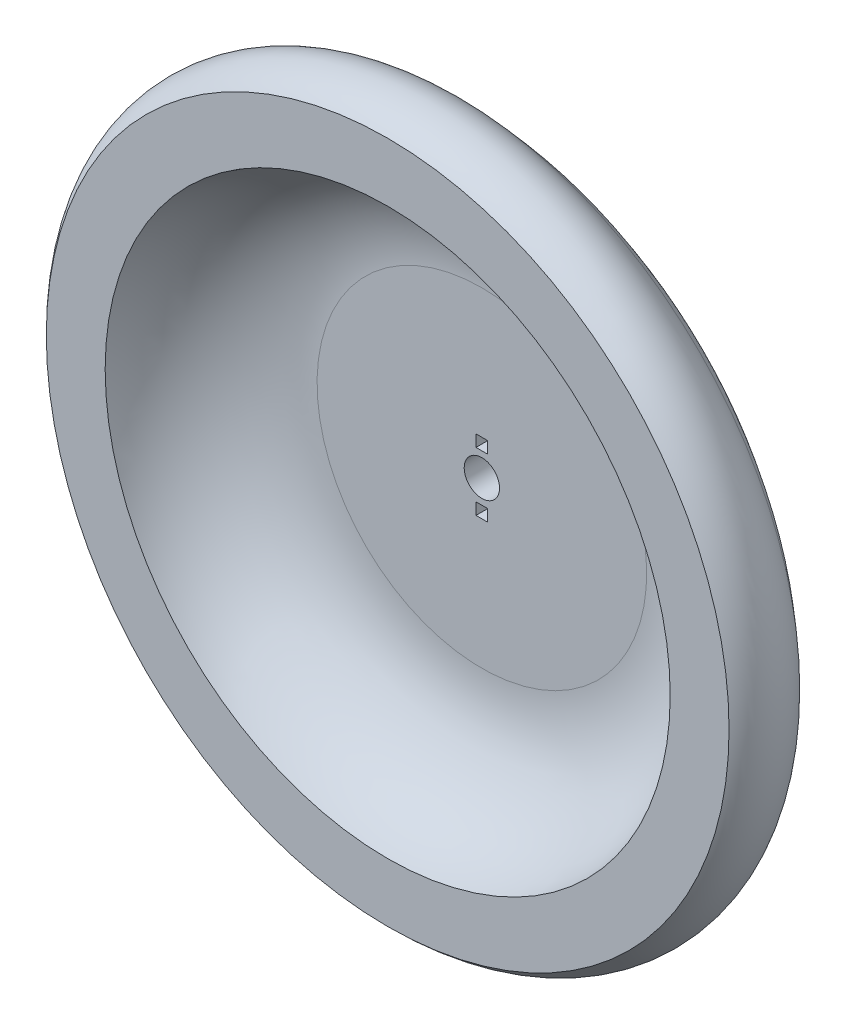
ISO-10303-21;
HEADER;
FILE_DESCRIPTION(('STEP AP214'),'2;1');
FILE_NAME('part.step','',(''),(''),'','','');
FILE_SCHEMA(('AUTOMOTIVE_DESIGN { 1 0 10303 214 1 1 1 1 }'));
ENDSEC;
DATA;
#1=APPLICATION_CONTEXT('core data for automotive mechanical design processes');
#2=APPLICATION_PROTOCOL_DEFINITION('international standard','automotive_design',2000,#1);
#3=PRODUCT_CONTEXT('',#1,'mechanical');
#4=PRODUCT('Part','Part','',(#3));
#5=PRODUCT_RELATED_PRODUCT_CATEGORY('part','',(#4));
#6=PRODUCT_DEFINITION_FORMATION('','',#4);
#7=PRODUCT_DEFINITION_CONTEXT('part definition',#1,'design');
#8=PRODUCT_DEFINITION('design','',#6,#7);
#9=PRODUCT_DEFINITION_SHAPE('','',#8);
#10=(LENGTH_UNIT() NAMED_UNIT(*) SI_UNIT(.MILLI.,.METRE.));
#11=(NAMED_UNIT(*) PLANE_ANGLE_UNIT() SI_UNIT($,.RADIAN.));
#12=(NAMED_UNIT(*) SI_UNIT($,.STERADIAN.) SOLID_ANGLE_UNIT());
#13=UNCERTAINTY_MEASURE_WITH_UNIT(LENGTH_MEASURE(1.E-05),#10,'distance_accuracy_value','');
#14=(GEOMETRIC_REPRESENTATION_CONTEXT(3) GLOBAL_UNCERTAINTY_ASSIGNED_CONTEXT((#13)) GLOBAL_UNIT_ASSIGNED_CONTEXT((#10,
#11,#12)) REPRESENTATION_CONTEXT('',''));
#15=CARTESIAN_POINT('',(0.,0.,0.));
#16=DIRECTION('',(0.,0.,1.));
#17=DIRECTION('',(1.,0.,0.));
#18=AXIS2_PLACEMENT_3D('',#15,#16,#17);
#19=CARTESIAN_POINT('',(0.,0.,-6.));
#20=DIRECTION('',(0.,0.,-1.));
#21=DIRECTION('',(0.,1.,0.));
#22=AXIS2_PLACEMENT_3D('',#19,#20,#21);
#23=TOROIDAL_SURFACE('',#22,26.1428571428571,4.14285714285714);
#24=CARTESIAN_POINT('',(0.,0.,-3.));
#25=DIRECTION('',(0.,0.,-1.));
#26=DIRECTION('',(0.,1.,0.));
#27=AXIS2_PLACEMENT_3D('',#24,#25,#26);
#28=CIRCLE('',#27,29.);
#29=CARTESIAN_POINT('',(0.,29.,-3.));
#30=VERTEX_POINT('',#29);
#31=EDGE_CURVE('E11',#30,#30,#28,.T.);
#32=ORIENTED_EDGE('',*,*,#31,.T.);
#33=EDGE_LOOP('',(#32));
#34=FACE_BOUND('',#33,.T.);
#35=CARTESIAN_POINT('',(0.,0.,-9.));
#36=DIRECTION('',(0.,0.,-1.));
#37=DIRECTION('',(0.,1.,0.));
#38=AXIS2_PLACEMENT_3D('',#35,#36,#37);
#39=CIRCLE('',#38,29.);
#40=CARTESIAN_POINT('',(0.,29.,-9.));
#41=VERTEX_POINT('',#40);
#42=EDGE_CURVE('E204',#41,#41,#39,.T.);
#43=ORIENTED_EDGE('',*,*,#42,.F.);
#44=EDGE_LOOP('',(#43));
#45=FACE_BOUND('',#44,.T.);
#46=ADVANCED_FACE('F39',(#34,#45),#23,.T.);
#47=CARTESIAN_POINT('',(0.,24.,-3.));
#48=DIRECTION('',(0.,0.,1.));
#49=DIRECTION('',(0.,-1.,0.));
#50=AXIS2_PLACEMENT_3D('',#47,#48,#49);
#51=PLANE('',#50);
#52=CARTESIAN_POINT('',(0.,0.,-3.));
#53=DIRECTION('',(0.,0.,-1.));
#54=DIRECTION('',(0.,1.,0.));
#55=AXIS2_PLACEMENT_3D('',#52,#53,#54);
#56=CIRCLE('',#55,24.);
#57=CARTESIAN_POINT('',(0.,24.,-3.));
#58=VERTEX_POINT('',#57);
#59=EDGE_CURVE('E47',#58,#58,#56,.T.);
#60=ORIENTED_EDGE('',*,*,#59,.T.);
#61=EDGE_LOOP('',(#60));
#62=FACE_BOUND('',#61,.T.);
#63=ORIENTED_EDGE('',*,*,#31,.F.);
#64=EDGE_LOOP('',(#63));
#65=FACE_BOUND('',#64,.T.);
#66=ADVANCED_FACE('F219',(#62,#65),#51,.T.);
#67=CARTESIAN_POINT('',(0.,0.,-0.750000000000003));
#68=DIRECTION('',(0.,0.,-1.));
#69=DIRECTION('',(0.,1.,0.));
#70=AXIS2_PLACEMENT_3D('',#67,#68,#69);
#71=TOROIDAL_SURFACE('',#70,14.,10.25);
#72=CARTESIAN_POINT('',(0.,0.,-11.));
#73=DIRECTION('',(0.,0.,-1.));
#74=DIRECTION('',(0.,1.,0.));
#75=AXIS2_PLACEMENT_3D('',#72,#73,#74);
#76=CIRCLE('',#75,14.);
#77=CARTESIAN_POINT('',(0.,14.,-11.));
#78=VERTEX_POINT('',#77);
#79=EDGE_CURVE('E212',#78,#78,#76,.T.);
#80=ORIENTED_EDGE('',*,*,#79,.T.);
#81=EDGE_LOOP('',(#80));
#82=FACE_BOUND('',#81,.T.);
#83=ORIENTED_EDGE('',*,*,#59,.F.);
#84=EDGE_LOOP('',(#83));
#85=FACE_BOUND('',#84,.T.);
#86=ADVANCED_FACE('F222',(#82,#85),#71,.F.);
#87=CARTESIAN_POINT('',(0.,14.,-11.));
#88=DIRECTION('',(0.,0.,1.));
#89=DIRECTION('',(0.,-1.,0.));
#90=AXIS2_PLACEMENT_3D('',#87,#88,#89);
#91=PLANE('',#90);
#92=DIRECTION('',(0.,-1.,0.));
#93=VECTOR('',#92,1.);
#94=CARTESIAN_POINT('',(-0.5,3.00000000000001,-11.));
#95=LINE('',#94,#93);
#96=CARTESIAN_POINT('',(-0.5,3.00000000000001,-11.));
#97=VERTEX_POINT('',#96);
#98=CARTESIAN_POINT('',(-0.5,2.00000000000001,-11.));
#99=VERTEX_POINT('',#98);
#100=EDGE_CURVE('E54',#97,#99,#95,.T.);
#101=ORIENTED_EDGE('',*,*,#100,.F.);
#102=DIRECTION('',(-1.,0.,0.));
#103=VECTOR('',#102,1.);
#104=CARTESIAN_POINT('',(-0.5,3.00000000000001,-11.));
#105=LINE('',#104,#103);
#106=CARTESIAN_POINT('',(0.5,3.00000000000001,-11.));
#107=VERTEX_POINT('',#106);
#108=EDGE_CURVE('E127',#107,#97,#105,.T.);
#109=ORIENTED_EDGE('',*,*,#108,.F.);
#110=DIRECTION('',(0.,1.,0.));
#111=VECTOR('',#110,1.);
#112=CARTESIAN_POINT('',(0.5,3.00000000000001,-11.));
#113=LINE('',#112,#111);
#114=CARTESIAN_POINT('',(0.5,2.00000000000001,-11.));
#115=VERTEX_POINT('',#114);
#116=EDGE_CURVE('E131',#115,#107,#113,.T.);
#117=ORIENTED_EDGE('',*,*,#116,.F.);
#118=DIRECTION('',(1.,0.,0.));
#119=VECTOR('',#118,1.);
#120=CARTESIAN_POINT('',(-0.5,2.00000000000001,-11.));
#121=LINE('',#120,#119);
#122=EDGE_CURVE('E140',#99,#115,#121,.T.);
#123=ORIENTED_EDGE('',*,*,#122,.F.);
#124=EDGE_LOOP('',(#101,#109,#117,#123));
#125=FACE_BOUND('',#124,.T.);
#126=DIRECTION('',(0.,-1.,0.));
#127=VECTOR('',#126,1.);
#128=CARTESIAN_POINT('',(-0.5,-2.,-11.));
#129=LINE('',#128,#127);
#130=CARTESIAN_POINT('',(-0.5,-2.,-11.));
#131=VERTEX_POINT('',#130);
#132=CARTESIAN_POINT('',(-0.5,-3.,-11.));
#133=VERTEX_POINT('',#132);
#134=EDGE_CURVE('E62',#131,#133,#129,.T.);
#135=ORIENTED_EDGE('',*,*,#134,.F.);
#136=DIRECTION('',(-1.,0.,0.));
#137=VECTOR('',#136,1.);
#138=CARTESIAN_POINT('',(-0.5,-2.,-11.));
#139=LINE('',#138,#137);
#140=CARTESIAN_POINT('',(0.5,-2.,-11.));
#141=VERTEX_POINT('',#140);
#142=EDGE_CURVE('E161',#141,#131,#139,.T.);
#143=ORIENTED_EDGE('',*,*,#142,.F.);
#144=DIRECTION('',(0.,1.,0.));
#145=VECTOR('',#144,1.);
#146=CARTESIAN_POINT('',(0.5,-2.,-11.));
#147=LINE('',#146,#145);
#148=CARTESIAN_POINT('',(0.5,-3.,-11.));
#149=VERTEX_POINT('',#148);
#150=EDGE_CURVE('E180',#149,#141,#147,.T.);
#151=ORIENTED_EDGE('',*,*,#150,.F.);
#152=DIRECTION('',(1.,0.,0.));
#153=VECTOR('',#152,1.);
#154=CARTESIAN_POINT('',(-0.5,-3.,-11.));
#155=LINE('',#154,#153);
#156=EDGE_CURVE('E176',#133,#149,#155,.T.);
#157=ORIENTED_EDGE('',*,*,#156,.F.);
#158=EDGE_LOOP('',(#135,#143,#151,#157));
#159=FACE_BOUND('',#158,.T.);
#160=CARTESIAN_POINT('',(0.,0.,-11.));
#161=DIRECTION('',(0.,0.,1.));
#162=DIRECTION('',(0.,-1.,0.));
#163=AXIS2_PLACEMENT_3D('',#160,#161,#162);
#164=CIRCLE('',#163,1.5);
#165=CARTESIAN_POINT('',(0.,-1.5,-11.));
#166=VERTEX_POINT('',#165);
#167=EDGE_CURVE('E200',#166,#166,#164,.T.);
#168=ORIENTED_EDGE('',*,*,#167,.F.);
#169=EDGE_LOOP('',(#168));
#170=FACE_BOUND('',#169,.T.);
#171=ORIENTED_EDGE('',*,*,#79,.F.);
#172=EDGE_LOOP('',(#171));
#173=FACE_BOUND('',#172,.T.);
#174=ADVANCED_FACE('F224',(#125,#159,#170,#173),#91,.T.);
#175=CARTESIAN_POINT('',(0.,0.,-15.));
#176=DIRECTION('',(0.,0.,-1.));
#177=DIRECTION('',(0.,1.,0.));
#178=AXIS2_PLACEMENT_3D('',#175,#176,#177);
#179=PLANE('',#178);
#180=CARTESIAN_POINT('',(0.,0.,-15.));
#181=DIRECTION('',(0.,0.,-1.));
#182=DIRECTION('',(0.,1.,0.));
#183=AXIS2_PLACEMENT_3D('',#180,#181,#182);
#184=CIRCLE('',#183,1.5);
#185=CARTESIAN_POINT('',(0.,1.5,-15.));
#186=VERTEX_POINT('',#185);
#187=EDGE_CURVE('E150',#186,#186,#184,.T.);
#188=ORIENTED_EDGE('',*,*,#187,.F.);
#189=EDGE_LOOP('',(#188));
#190=FACE_BOUND('',#189,.T.);
#191=CARTESIAN_POINT('',(0.,0.,-15.));
#192=DIRECTION('',(0.,0.,-1.));
#193=DIRECTION('',(0.,1.,0.));
#194=AXIS2_PLACEMENT_3D('',#191,#192,#193);
#195=CIRCLE('',#194,14.);
#196=CARTESIAN_POINT('',(0.,14.,-15.));
#197=VERTEX_POINT('',#196);
#198=EDGE_CURVE('E208',#197,#197,#195,.T.);
#199=ORIENTED_EDGE('',*,*,#198,.T.);
#200=EDGE_LOOP('',(#199));
#201=FACE_BOUND('',#200,.T.);
#202=ADVANCED_FACE('F231',(#190,#201),#179,.T.);
#203=CARTESIAN_POINT('',(0.,0.,6.75));
#204=DIRECTION('',(0.,0.,-1.));
#205=DIRECTION('',(0.,1.,0.));
#206=AXIS2_PLACEMENT_3D('',#203,#204,#205);
#207=DEGENERATE_TOROIDAL_SURFACE('',#206,14.,21.75,.T.);
#208=ORIENTED_EDGE('',*,*,#42,.T.);
#209=EDGE_LOOP('',(#208));
#210=FACE_BOUND('',#209,.T.);
#211=ORIENTED_EDGE('',*,*,#198,.F.);
#212=EDGE_LOOP('',(#211));
#213=FACE_BOUND('',#212,.T.);
#214=ADVANCED_FACE('F242',(#210,#213),#207,.T.);
#215=CARTESIAN_POINT('',(0.,0.,-15.));
#216=DIRECTION('',(0.,0.,-1.));
#217=DIRECTION('',(0.,1.,0.));
#218=AXIS2_PLACEMENT_3D('',#215,#216,#217);
#219=CYLINDRICAL_SURFACE('',#218,1.5);
#220=ORIENTED_EDGE('',*,*,#167,.T.);
#221=EDGE_LOOP('',(#220));
#222=FACE_BOUND('',#221,.T.);
#223=ORIENTED_EDGE('',*,*,#187,.T.);
#224=EDGE_LOOP('',(#223));
#225=FACE_BOUND('',#224,.T.);
#226=ADVANCED_FACE('F245',(#222,#225),#219,.F.);
#227=CARTESIAN_POINT('',(-0.5,-2.,-13.));
#228=DIRECTION('',(-1.,0.,0.));
#229=DIRECTION('',(0.,0.,1.));
#230=AXIS2_PLACEMENT_3D('',#227,#228,#229);
#231=PLANE('',#230);
#232=ORIENTED_EDGE('',*,*,#134,.T.);
#233=DIRECTION('',(0.,0.,1.));
#234=VECTOR('',#233,1.);
#235=CARTESIAN_POINT('',(-0.5,-3.,-13.));
#236=LINE('',#235,#234);
#237=CARTESIAN_POINT('',(-0.5,-3.,-13.));
#238=VERTEX_POINT('',#237);
#239=EDGE_CURVE('E173',#238,#133,#236,.T.);
#240=ORIENTED_EDGE('',*,*,#239,.F.);
#241=DIRECTION('',(0.,-1.,0.));
#242=VECTOR('',#241,1.);
#243=CARTESIAN_POINT('',(-0.5,-2.,-13.));
#244=LINE('',#243,#242);
#245=CARTESIAN_POINT('',(-0.5,-2.,-13.));
#246=VERTEX_POINT('',#245);
#247=EDGE_CURVE('E156',#246,#238,#244,.T.);
#248=ORIENTED_EDGE('',*,*,#247,.F.);
#249=DIRECTION('',(0.,0.,1.));
#250=VECTOR('',#249,1.);
#251=CARTESIAN_POINT('',(-0.5,-2.,-13.));
#252=LINE('',#251,#250);
#253=EDGE_CURVE('E141',#246,#131,#252,.T.);
#254=ORIENTED_EDGE('',*,*,#253,.T.);
#255=EDGE_LOOP('',(#232,#240,#248,#254));
#256=FACE_BOUND('',#255,.T.);
#257=ADVANCED_FACE('F258',(#256),#231,.F.);
#258=CARTESIAN_POINT('',(-0.5,-2.,-13.));
#259=DIRECTION('',(0.,1.,0.));
#260=DIRECTION('',(0.,0.,1.));
#261=AXIS2_PLACEMENT_3D('',#258,#259,#260);
#262=PLANE('',#261);
#263=ORIENTED_EDGE('',*,*,#142,.T.);
#264=ORIENTED_EDGE('',*,*,#253,.F.);
#265=DIRECTION('',(-1.,0.,0.));
#266=VECTOR('',#265,1.);
#267=CARTESIAN_POINT('',(-0.5,-2.,-13.));
#268=LINE('',#267,#266);
#269=CARTESIAN_POINT('',(0.5,-2.,-13.));
#270=VERTEX_POINT('',#269);
#271=EDGE_CURVE('E169',#270,#246,#268,.T.);
#272=ORIENTED_EDGE('',*,*,#271,.F.);
#273=DIRECTION('',(0.,0.,1.));
#274=VECTOR('',#273,1.);
#275=CARTESIAN_POINT('',(0.5,-2.,-13.));
#276=LINE('',#275,#274);
#277=EDGE_CURVE('E189',#270,#141,#276,.T.);
#278=ORIENTED_EDGE('',*,*,#277,.T.);
#279=EDGE_LOOP('',(#263,#264,#272,#278));
#280=FACE_BOUND('',#279,.T.);
#281=ADVANCED_FACE('F262',(#280),#262,.F.);
#282=CARTESIAN_POINT('',(0.5,-2.,-13.));
#283=DIRECTION('',(1.,0.,0.));
#284=DIRECTION('',(0.,0.,-1.));
#285=AXIS2_PLACEMENT_3D('',#282,#283,#284);
#286=PLANE('',#285);
#287=ORIENTED_EDGE('',*,*,#150,.T.);
#288=ORIENTED_EDGE('',*,*,#277,.F.);
#289=DIRECTION('',(0.,1.,0.));
#290=VECTOR('',#289,1.);
#291=CARTESIAN_POINT('',(0.5,-2.,-13.));
#292=LINE('',#291,#290);
#293=CARTESIAN_POINT('',(0.5,-3.,-13.));
#294=VERTEX_POINT('',#293);
#295=EDGE_CURVE('E165',#294,#270,#292,.T.);
#296=ORIENTED_EDGE('',*,*,#295,.F.);
#297=DIRECTION('',(0.,0.,1.));
#298=VECTOR('',#297,1.);
#299=CARTESIAN_POINT('',(0.5,-3.,-13.));
#300=LINE('',#299,#298);
#301=EDGE_CURVE('E192',#294,#149,#300,.T.);
#302=ORIENTED_EDGE('',*,*,#301,.T.);
#303=EDGE_LOOP('',(#287,#288,#296,#302));
#304=FACE_BOUND('',#303,.T.);
#305=ADVANCED_FACE('F267',(#304),#286,.F.);
#306=CARTESIAN_POINT('',(-0.5,-3.,-13.));
#307=DIRECTION('',(0.,-1.,0.));
#308=DIRECTION('',(0.,0.,-1.));
#309=AXIS2_PLACEMENT_3D('',#306,#307,#308);
#310=PLANE('',#309);
#311=ORIENTED_EDGE('',*,*,#156,.T.);
#312=ORIENTED_EDGE('',*,*,#301,.F.);
#313=DIRECTION('',(1.,0.,0.));
#314=VECTOR('',#313,1.);
#315=CARTESIAN_POINT('',(-0.5,-3.,-13.));
#316=LINE('',#315,#314);
#317=EDGE_CURVE('E160',#238,#294,#316,.T.);
#318=ORIENTED_EDGE('',*,*,#317,.F.);
#319=ORIENTED_EDGE('',*,*,#239,.T.);
#320=EDGE_LOOP('',(#311,#312,#318,#319));
#321=FACE_BOUND('',#320,.T.);
#322=ADVANCED_FACE('F263',(#321),#310,.F.);
#323=CARTESIAN_POINT('',(0.,0.,-13.));
#324=DIRECTION('',(0.,0.,1.));
#325=DIRECTION('',(1.,0.,0.));
#326=AXIS2_PLACEMENT_3D('',#323,#324,#325);
#327=PLANE('',#326);
#328=ORIENTED_EDGE('',*,*,#247,.T.);
#329=ORIENTED_EDGE('',*,*,#317,.T.);
#330=ORIENTED_EDGE('',*,*,#295,.T.);
#331=ORIENTED_EDGE('',*,*,#271,.T.);
#332=EDGE_LOOP('',(#328,#329,#330,#331));
#333=FACE_BOUND('',#332,.T.);
#334=ADVANCED_FACE('F266',(#333),#327,.T.);
#335=CARTESIAN_POINT('',(-0.5,3.00000000000001,-13.));
#336=DIRECTION('',(-1.,0.,0.));
#337=DIRECTION('',(0.,0.,1.));
#338=AXIS2_PLACEMENT_3D('',#335,#336,#337);
#339=PLANE('',#338);
#340=ORIENTED_EDGE('',*,*,#100,.T.);
#341=DIRECTION('',(0.,0.,1.));
#342=VECTOR('',#341,1.);
#343=CARTESIAN_POINT('',(-0.5,2.00000000000001,-13.));
#344=LINE('',#343,#342);
#345=CARTESIAN_POINT('',(-0.5,2.00000000000001,-13.));
#346=VERTEX_POINT('',#345);
#347=EDGE_CURVE('E102',#346,#99,#344,.T.);
#348=ORIENTED_EDGE('',*,*,#347,.F.);
#349=DIRECTION('',(0.,-1.,0.));
#350=VECTOR('',#349,1.);
#351=CARTESIAN_POINT('',(-0.5,3.00000000000001,-13.));
#352=LINE('',#351,#350);
#353=CARTESIAN_POINT('',(-0.5,3.00000000000001,-13.));
#354=VERTEX_POINT('',#353);
#355=EDGE_CURVE('E106',#354,#346,#352,.T.);
#356=ORIENTED_EDGE('',*,*,#355,.F.);
#357=DIRECTION('',(0.,0.,1.));
#358=VECTOR('',#357,1.);
#359=CARTESIAN_POINT('',(-0.5,3.00000000000001,-13.));
#360=LINE('',#359,#358);
#361=EDGE_CURVE('E147',#354,#97,#360,.T.);
#362=ORIENTED_EDGE('',*,*,#361,.T.);
#363=EDGE_LOOP('',(#340,#348,#356,#362));
#364=FACE_BOUND('',#363,.T.);
#365=ADVANCED_FACE('F104',(#364),#339,.F.);
#366=CARTESIAN_POINT('',(-0.5,3.00000000000001,-13.));
#367=DIRECTION('',(0.,1.,0.));
#368=DIRECTION('',(0.,0.,1.));
#369=AXIS2_PLACEMENT_3D('',#366,#367,#368);
#370=PLANE('',#369);
#371=ORIENTED_EDGE('',*,*,#108,.T.);
#372=ORIENTED_EDGE('',*,*,#361,.F.);
#373=DIRECTION('',(-1.,0.,0.));
#374=VECTOR('',#373,1.);
#375=CARTESIAN_POINT('',(-0.5,3.00000000000001,-13.));
#376=LINE('',#375,#374);
#377=CARTESIAN_POINT('',(0.5,3.00000000000001,-13.));
#378=VERTEX_POINT('',#377);
#379=EDGE_CURVE('E113',#378,#354,#376,.T.);
#380=ORIENTED_EDGE('',*,*,#379,.F.);
#381=DIRECTION('',(0.,0.,1.));
#382=VECTOR('',#381,1.);
#383=CARTESIAN_POINT('',(0.5,3.00000000000001,-13.));
#384=LINE('',#383,#382);
#385=EDGE_CURVE('E151',#378,#107,#384,.T.);
#386=ORIENTED_EDGE('',*,*,#385,.T.);
#387=EDGE_LOOP('',(#371,#372,#380,#386));
#388=FACE_BOUND('',#387,.T.);
#389=ADVANCED_FACE('F280',(#388),#370,.F.);
#390=CARTESIAN_POINT('',(0.5,3.00000000000001,-13.));
#391=DIRECTION('',(1.,0.,0.));
#392=DIRECTION('',(0.,0.,-1.));
#393=AXIS2_PLACEMENT_3D('',#390,#391,#392);
#394=PLANE('',#393);
#395=ORIENTED_EDGE('',*,*,#116,.T.);
#396=ORIENTED_EDGE('',*,*,#385,.F.);
#397=DIRECTION('',(0.,1.,0.));
#398=VECTOR('',#397,1.);
#399=CARTESIAN_POINT('',(0.5,3.00000000000001,-13.));
#400=LINE('',#399,#398);
#401=CARTESIAN_POINT('',(0.5,2.00000000000001,-13.));
#402=VERTEX_POINT('',#401);
#403=EDGE_CURVE('E122',#402,#378,#400,.T.);
#404=ORIENTED_EDGE('',*,*,#403,.F.);
#405=DIRECTION('',(0.,0.,1.));
#406=VECTOR('',#405,1.);
#407=CARTESIAN_POINT('',(0.5,2.00000000000001,-13.));
#408=LINE('',#407,#406);
#409=EDGE_CURVE('E112',#402,#115,#408,.T.);
#410=ORIENTED_EDGE('',*,*,#409,.T.);
#411=EDGE_LOOP('',(#395,#396,#404,#410));
#412=FACE_BOUND('',#411,.T.);
#413=ADVANCED_FACE('F283',(#412),#394,.F.);
#414=CARTESIAN_POINT('',(-0.5,2.00000000000001,-13.));
#415=DIRECTION('',(0.,-1.,0.));
#416=DIRECTION('',(0.,0.,-1.));
#417=AXIS2_PLACEMENT_3D('',#414,#415,#416);
#418=PLANE('',#417);
#419=ORIENTED_EDGE('',*,*,#122,.T.);
#420=ORIENTED_EDGE('',*,*,#409,.F.);
#421=DIRECTION('',(1.,0.,0.));
#422=VECTOR('',#421,1.);
#423=CARTESIAN_POINT('',(-0.5,2.00000000000001,-13.));
#424=LINE('',#423,#422);
#425=EDGE_CURVE('E116',#346,#402,#424,.T.);
#426=ORIENTED_EDGE('',*,*,#425,.F.);
#427=ORIENTED_EDGE('',*,*,#347,.T.);
#428=EDGE_LOOP('',(#419,#420,#426,#427));
#429=FACE_BOUND('',#428,.T.);
#430=ADVANCED_FACE('F117',(#429),#418,.F.);
#431=CARTESIAN_POINT('',(0.,0.,-13.));
#432=DIRECTION('',(0.,0.,1.));
#433=DIRECTION('',(1.,0.,0.));
#434=AXIS2_PLACEMENT_3D('',#431,#432,#433);
#435=PLANE('',#434);
#436=ORIENTED_EDGE('',*,*,#355,.T.);
#437=ORIENTED_EDGE('',*,*,#425,.T.);
#438=ORIENTED_EDGE('',*,*,#403,.T.);
#439=ORIENTED_EDGE('',*,*,#379,.T.);
#440=EDGE_LOOP('',(#436,#437,#438,#439));
#441=FACE_BOUND('',#440,.T.);
#442=ADVANCED_FACE('F124',(#441),#435,.T.);
#443=CLOSED_SHELL('',(#46,#66,#86,#174,#202,#214,#226,#257,#281,#305,#322,#334,#365,#389,#413,
#430,#442));
#444=MANIFOLD_SOLID_BREP('B2',#443);
#445=ADVANCED_BREP_SHAPE_REPRESENTATION('',(#18,#444),#14);
#446=SHAPE_DEFINITION_REPRESENTATION(#9,#445);
ENDSEC;
END-ISO-10303-21;
